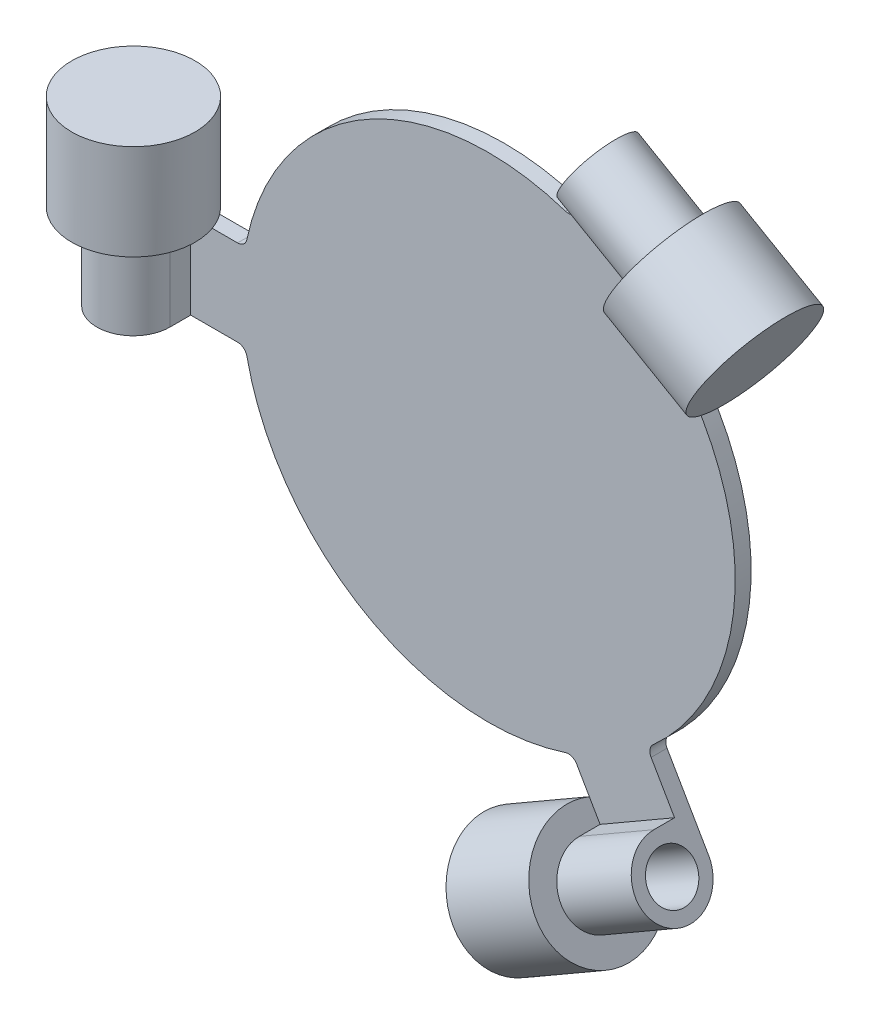
ISO-10303-21;
HEADER;
FILE_DESCRIPTION(('STEP AP214'),'2;1');
FILE_NAME('part.step','',(''),(''),'','','');
FILE_SCHEMA(('AUTOMOTIVE_DESIGN { 1 0 10303 214 1 1 1 1 }'));
ENDSEC;
DATA;
#1=APPLICATION_CONTEXT('core data for automotive mechanical design processes');
#2=APPLICATION_PROTOCOL_DEFINITION('international standard','automotive_design',2000,#1);
#3=PRODUCT_CONTEXT('',#1,'mechanical');
#4=PRODUCT('Part','Part','',(#3));
#5=PRODUCT_RELATED_PRODUCT_CATEGORY('part','',(#4));
#6=PRODUCT_DEFINITION_FORMATION('','',#4);
#7=PRODUCT_DEFINITION_CONTEXT('part definition',#1,'design');
#8=PRODUCT_DEFINITION('design','',#6,#7);
#9=PRODUCT_DEFINITION_SHAPE('','',#8);
#10=(LENGTH_UNIT() NAMED_UNIT(*) SI_UNIT(.MILLI.,.METRE.));
#11=(NAMED_UNIT(*) PLANE_ANGLE_UNIT() SI_UNIT($,.RADIAN.));
#12=(NAMED_UNIT(*) SI_UNIT($,.STERADIAN.) SOLID_ANGLE_UNIT());
#13=UNCERTAINTY_MEASURE_WITH_UNIT(LENGTH_MEASURE(1.E-05),#10,'distance_accuracy_value','');
#14=(GEOMETRIC_REPRESENTATION_CONTEXT(3) GLOBAL_UNCERTAINTY_ASSIGNED_CONTEXT((#13)) GLOBAL_UNIT_ASSIGNED_CONTEXT((#10,
#11,#12)) REPRESENTATION_CONTEXT('',''));
#15=CARTESIAN_POINT('',(0.,0.,0.));
#16=DIRECTION('',(0.,0.,1.));
#17=DIRECTION('',(1.,0.,0.));
#18=AXIS2_PLACEMENT_3D('',#15,#16,#17);
#19=CARTESIAN_POINT('',(35.05865704891,87.72337525384,11.5));
#20=DIRECTION('',(-0.500000000000017,-0.866025403784429,0.));
#21=DIRECTION('',(0.866025403784429,-0.500000000000017,0.));
#22=AXIS2_PLACEMENT_3D('',#19,#20,#21);
#23=PLANE('',#22);
#24=DIRECTION('',(0.,0.,1.));
#25=VECTOR('',#24,1.);
#26=CARTESIAN_POINT('',(35.05865704891,87.72337525385,0.));
#27=LINE('',#26,#25);
#28=CARTESIAN_POINT('',(35.05865704891,87.72337525385,5.));
#29=VERTEX_POINT('',#28);
#30=CARTESIAN_POINT('',(35.05865704891,87.7233752538495,11.5));
#31=VERTEX_POINT('',#30);
#32=EDGE_CURVE('E306',#29,#31,#27,.T.);
#33=ORIENTED_EDGE('',*,*,#32,.F.);
#34=DIRECTION('',(-0.86602540378428,0.500000000000275,0.));
#35=VECTOR('',#34,1.);
#36=CARTESIAN_POINT('',(58.44134295109,74.22337525384,5.));
#37=LINE('',#36,#35);
#38=CARTESIAN_POINT('',(58.4413429510908,74.2233752538395,5.));
#39=VERTEX_POINT('',#38);
#40=EDGE_CURVE('E313',#39,#29,#37,.T.);
#41=ORIENTED_EDGE('',*,*,#40,.F.);
#42=DIRECTION('',(0.,0.,1.));
#43=VECTOR('',#42,1.);
#44=CARTESIAN_POINT('',(58.4413429510911,74.2233752538393,0.));
#45=LINE('',#44,#43);
#46=CARTESIAN_POINT('',(58.4413429510918,74.2233752538431,11.5));
#47=VERTEX_POINT('',#46);
#48=EDGE_CURVE('E311',#47,#39,#45,.F.);
#49=ORIENTED_EDGE('',*,*,#48,.F.);
#50=DIRECTION('',(0.866025403784429,-0.500000000000017,0.));
#51=VECTOR('',#50,1.);
#52=CARTESIAN_POINT('',(35.0586570489098,87.7233752538491,11.5));
#53=LINE('',#52,#51);
#54=EDGE_CURVE('E212',#31,#47,#53,.T.);
#55=ORIENTED_EDGE('',*,*,#54,.F.);
#56=EDGE_LOOP('',(#33,#41,#49,#55));
#57=FACE_BOUND('',#56,.T.);
#58=ADVANCED_FACE('F35',(#57),#23,.T.);
#59=CARTESIAN_POINT('',(40.80865704891,97.68266739737,11.5));
#60=DIRECTION('',(0.866025403784429,-0.500000000000017,0.));
#61=DIRECTION('',(0.500000000000017,0.866025403784429,0.));
#62=AXIS2_PLACEMENT_3D('',#59,#60,#61);
#63=CYLINDRICAL_SURFACE('',#62,7.5);
#64=CARTESIAN_POINT('',(64.191342951091,84.1826673973687,11.5));
#65=DIRECTION('',(0.866025403784429,-0.500000000000017,0.));
#66=DIRECTION('',(0.500000000000017,0.866025403784429,0.));
#67=AXIS2_PLACEMENT_3D('',#64,#65,#66);
#68=CIRCLE('',#67,7.5);
#69=CARTESIAN_POINT('',(67.9413429510911,90.677857925752,11.5));
#70=VERTEX_POINT('',#69);
#71=EDGE_CURVE('E317',#70,#70,#68,.F.);
#72=ORIENTED_EDGE('',*,*,#71,.F.);
#73=EDGE_LOOP('',(#72));
#74=FACE_BOUND('',#73,.T.);
#75=CARTESIAN_POINT('',(40.808657048913,97.6826673973682,11.5));
#76=DIRECTION('',(0.866025403784429,-0.500000000000017,0.));
#77=DIRECTION('',(0.500000000000017,0.866025403784429,0.));
#78=AXIS2_PLACEMENT_3D('',#75,#76,#77);
#79=CIRCLE('',#78,7.5);
#80=CARTESIAN_POINT('',(44.5586570489132,104.177857925751,11.5));
#81=VERTEX_POINT('',#80);
#82=EDGE_CURVE('E305',#81,#81,#79,.T.);
#83=ORIENTED_EDGE('',*,*,#82,.F.);
#84=EDGE_LOOP('',(#83));
#85=FACE_BOUND('',#84,.T.);
#86=ADVANCED_FACE('F705',(#74,#85),#63,.F.);
#87=CARTESIAN_POINT('',(-93.5,-13.5,11.5));
#88=DIRECTION('',(1.,0.,0.));
#89=DIRECTION('',(0.,0.,-1.));
#90=AXIS2_PLACEMENT_3D('',#87,#88,#89);
#91=PLANE('',#90);
#92=DIRECTION('',(0.,0.,-1.));
#93=VECTOR('',#92,1.);
#94=CARTESIAN_POINT('',(-93.5,-13.5,0.));
#95=LINE('',#94,#93);
#96=CARTESIAN_POINT('',(-93.5,-13.5,5.));
#97=VERTEX_POINT('',#96);
#98=CARTESIAN_POINT('',(-93.5,-13.5,11.5));
#99=VERTEX_POINT('',#98);
#100=EDGE_CURVE('E275',#97,#99,#95,.F.);
#101=ORIENTED_EDGE('',*,*,#100,.F.);
#102=DIRECTION('',(0.,1.,0.));
#103=VECTOR('',#102,1.);
#104=CARTESIAN_POINT('',(-93.5,0.,5.));
#105=LINE('',#104,#103);
#106=CARTESIAN_POINT('',(-93.5,13.5,5.));
#107=VERTEX_POINT('',#106);
#108=EDGE_CURVE('E331',#107,#97,#105,.F.);
#109=ORIENTED_EDGE('',*,*,#108,.F.);
#110=DIRECTION('',(0.,0.,1.));
#111=VECTOR('',#110,1.);
#112=CARTESIAN_POINT('',(-93.5,13.5,0.));
#113=LINE('',#112,#111);
#114=CARTESIAN_POINT('',(-93.5,13.5,11.5));
#115=VERTEX_POINT('',#114);
#116=EDGE_CURVE('E286',#115,#107,#113,.F.);
#117=ORIENTED_EDGE('',*,*,#116,.F.);
#118=DIRECTION('',(0.,1.,0.));
#119=VECTOR('',#118,1.);
#120=CARTESIAN_POINT('',(-93.5,-13.5,11.5));
#121=LINE('',#120,#119);
#122=EDGE_CURVE('E404',#99,#115,#121,.T.);
#123=ORIENTED_EDGE('',*,*,#122,.F.);
#124=EDGE_LOOP('',(#101,#109,#117,#123));
#125=FACE_BOUND('',#124,.T.);
#126=ADVANCED_FACE('F467',(#125),#91,.T.);
#127=CARTESIAN_POINT('',(-105.,-13.5,11.5));
#128=DIRECTION('',(0.,1.,0.));
#129=DIRECTION('',(0.,0.,1.));
#130=AXIS2_PLACEMENT_3D('',#127,#128,#129);
#131=CYLINDRICAL_SURFACE('',#130,7.5);
#132=CARTESIAN_POINT('',(-105.,13.5,11.5));
#133=DIRECTION('',(0.,1.,0.));
#134=DIRECTION('',(0.,0.,1.));
#135=AXIS2_PLACEMENT_3D('',#132,#133,#134);
#136=CIRCLE('',#135,7.5);
#137=CARTESIAN_POINT('',(-105.,13.5,19.));
#138=VERTEX_POINT('',#137);
#139=EDGE_CURVE('E405',#138,#138,#136,.F.);
#140=ORIENTED_EDGE('',*,*,#139,.F.);
#141=EDGE_LOOP('',(#140));
#142=FACE_BOUND('',#141,.T.);
#143=CARTESIAN_POINT('',(-105.,-13.5,11.5));
#144=DIRECTION('',(0.,1.,0.));
#145=DIRECTION('',(0.,0.,1.));
#146=AXIS2_PLACEMENT_3D('',#143,#144,#145);
#147=CIRCLE('',#146,7.5);
#148=CARTESIAN_POINT('',(-105.,-13.5,19.));
#149=VERTEX_POINT('',#148);
#150=EDGE_CURVE('E274',#149,#149,#147,.T.);
#151=ORIENTED_EDGE('',*,*,#150,.F.);
#152=EDGE_LOOP('',(#151));
#153=FACE_BOUND('',#152,.T.);
#154=ADVANCED_FACE('F623',(#142,#153),#131,.F.);
#155=CARTESIAN_POINT('',(58.44134295109,-74.22337525385,11.5));
#156=DIRECTION('',(-0.500000000000017,0.866025403784429,0.));
#157=DIRECTION('',(-0.866025403784429,-0.500000000000017,0.));
#158=AXIS2_PLACEMENT_3D('',#155,#156,#157);
#159=PLANE('',#158);
#160=DIRECTION('',(0.,0.,1.));
#161=VECTOR('',#160,1.);
#162=CARTESIAN_POINT('',(58.44134295109,-74.22337525385,0.));
#163=LINE('',#162,#161);
#164=CARTESIAN_POINT('',(58.44134295109,-74.22337525385,5.));
#165=VERTEX_POINT('',#164);
#166=CARTESIAN_POINT('',(58.44134295109,-74.2233752538495,11.5));
#167=VERTEX_POINT('',#166);
#168=EDGE_CURVE('E244',#165,#167,#163,.T.);
#169=ORIENTED_EDGE('',*,*,#168,.F.);
#170=DIRECTION('',(0.86602540378444,0.499999999999998,0.));
#171=VECTOR('',#170,1.);
#172=CARTESIAN_POINT('',(35.05865704891,-87.72337525385,5.));
#173=LINE('',#172,#171);
#174=CARTESIAN_POINT('',(35.0586570489136,-87.7233752538479,5.));
#175=VERTEX_POINT('',#174);
#176=EDGE_CURVE('E329',#175,#165,#173,.T.);
#177=ORIENTED_EDGE('',*,*,#176,.F.);
#178=DIRECTION('',(0.,0.,1.));
#179=VECTOR('',#178,1.);
#180=CARTESIAN_POINT('',(35.0586570489155,-87.7233752538468,0.));
#181=LINE('',#180,#179);
#182=CARTESIAN_POINT('',(35.0586570489126,-87.7233752538482,11.5));
#183=VERTEX_POINT('',#182);
#184=EDGE_CURVE('E255',#183,#175,#181,.F.);
#185=ORIENTED_EDGE('',*,*,#184,.F.);
#186=DIRECTION('',(-0.866025403784429,-0.500000000000017,0.));
#187=VECTOR('',#186,1.);
#188=CARTESIAN_POINT('',(58.4413429510898,-74.2233752538491,11.5));
#189=LINE('',#188,#187);
#190=EDGE_CURVE('E326',#167,#183,#189,.T.);
#191=ORIENTED_EDGE('',*,*,#190,.F.);
#192=EDGE_LOOP('',(#169,#177,#185,#191));
#193=FACE_BOUND('',#192,.T.);
#194=ADVANCED_FACE('F628',(#193),#159,.T.);
#195=CARTESIAN_POINT('',(64.19134295109,-84.18266739737,11.5));
#196=DIRECTION('',(-0.866025403784429,-0.500000000000017,0.));
#197=DIRECTION('',(0.500000000000017,-0.866025403784429,0.));
#198=AXIS2_PLACEMENT_3D('',#195,#196,#197);
#199=CYLINDRICAL_SURFACE('',#198,7.5);
#200=CARTESIAN_POINT('',(40.8086570489332,-97.6826673973573,11.5));
#201=DIRECTION('',(-0.866025403784429,-0.500000000000017,0.));
#202=DIRECTION('',(0.500000000000017,-0.866025403784429,0.));
#203=AXIS2_PLACEMENT_3D('',#200,#201,#202);
#204=CIRCLE('',#203,7.5);
#205=CARTESIAN_POINT('',(44.5586570489334,-104.17785792574,11.5));
#206=VERTEX_POINT('',#205);
#207=EDGE_CURVE('E328',#206,#206,#204,.F.);
#208=ORIENTED_EDGE('',*,*,#207,.F.);
#209=EDGE_LOOP('',(#208));
#210=FACE_BOUND('',#209,.T.);
#211=CARTESIAN_POINT('',(64.191342951093,-84.1826673973682,11.5));
#212=DIRECTION('',(-0.866025403784429,-0.500000000000017,0.));
#213=DIRECTION('',(0.500000000000017,-0.866025403784429,0.));
#214=AXIS2_PLACEMENT_3D('',#211,#212,#213);
#215=CIRCLE('',#214,7.5);
#216=CARTESIAN_POINT('',(67.9413429510931,-90.6778579257515,11.5));
#217=VERTEX_POINT('',#216);
#218=EDGE_CURVE('E243',#217,#217,#215,.T.);
#219=ORIENTED_EDGE('',*,*,#218,.F.);
#220=EDGE_LOOP('',(#219));
#221=FACE_BOUND('',#220,.T.);
#222=ADVANCED_FACE('F636',(#210,#221),#199,.F.);
#223=CARTESIAN_POINT('',(0.,0.,5.));
#224=DIRECTION('',(0.,0.,1.));
#225=DIRECTION('',(1.,0.,0.));
#226=AXIS2_PLACEMENT_3D('',#223,#224,#225);
#227=PLANE('',#226);
#228=DIRECTION('',(0.500000000000017,0.866025403784429,0.));
#229=VECTOR('',#228,1.);
#230=CARTESIAN_POINT('',(49.84891100777,59.34084656743,5.));
#231=LINE('',#230,#229);
#232=CARTESIAN_POINT('',(55.0665253972339,68.3780197842836,5.));
#233=VERTEX_POINT('',#232);
#234=EDGE_CURVE('E316',#39,#233,#231,.F.);
#235=ORIENTED_EDGE('',*,*,#234,.F.);
#236=ORIENTED_EDGE('',*,*,#40,.T.);
#237=DIRECTION('',(-0.500000000000017,-0.866025403784429,0.));
#238=VECTOR('',#237,1.);
#239=CARTESIAN_POINT('',(35.05865704891,87.72337525385,5.));
#240=LINE('',#239,#238);
#241=CARTESIAN_POINT('',(27.7040882560926,74.9848884369295,5.));
#242=VERTEX_POINT('',#241);
#243=EDGE_CURVE('E216',#242,#29,#240,.F.);
#244=ORIENTED_EDGE('',*,*,#243,.F.);
#245=CARTESIAN_POINT('',(25.10601204474,76.48488843693,5.));
#246=DIRECTION('',(0.,0.,1.));
#247=DIRECTION('',(1.,0.,0.));
#248=AXIS2_PLACEMENT_3D('',#245,#246,#247);
#249=CIRCLE('',#248,3.);
#250=CARTESIAN_POINT('',(24.1703842666772,73.6345199237502,5.));
#251=VERTEX_POINT('',#250);
#252=EDGE_CURVE('E304',#242,#251,#249,.F.);
#253=ORIENTED_EDGE('',*,*,#252,.T.);
#254=CARTESIAN_POINT('',(0.,0.,5.));
#255=DIRECTION('',(0.,0.,1.));
#256=DIRECTION('',(1.,0.,0.));
#257=AXIS2_PLACEMENT_3D('',#254,#255,#256);
#258=CIRCLE('',#257,77.5);
#259=CARTESIAN_POINT('',(-75.8545569827783,15.8850931677007,5.));
#260=VERTEX_POINT('',#259);
#261=EDGE_CURVE('E300',#260,#251,#258,.F.);
#262=ORIENTED_EDGE('',*,*,#261,.F.);
#263=CARTESIAN_POINT('',(-78.79086241437,16.5,5.));
#264=DIRECTION('',(0.,0.,1.));
#265=DIRECTION('',(1.,0.,0.));
#266=AXIS2_PLACEMENT_3D('',#263,#264,#265);
#267=CIRCLE('',#266,3.);
#268=CARTESIAN_POINT('',(-78.79086241437,13.5,5.));
#269=VERTEX_POINT('',#268);
#270=EDGE_CURVE('E294',#260,#269,#267,.F.);
#271=ORIENTED_EDGE('',*,*,#270,.T.);
#272=DIRECTION('',(1.,0.,0.));
#273=VECTOR('',#272,1.);
#274=CARTESIAN_POINT('',(-76.31513611336,13.5,5.));
#275=LINE('',#274,#273);
#276=CARTESIAN_POINT('',(-86.7503648922814,13.5,5.));
#277=VERTEX_POINT('',#276);
#278=EDGE_CURVE('E289',#277,#269,#275,.T.);
#279=ORIENTED_EDGE('',*,*,#278,.F.);
#280=EDGE_CURVE('E344',#107,#277,#275,.T.);
#281=ORIENTED_EDGE('',*,*,#280,.F.);
#282=ORIENTED_EDGE('',*,*,#108,.T.);
#283=DIRECTION('',(1.,0.,0.));
#284=VECTOR('',#283,1.);
#285=CARTESIAN_POINT('',(-93.5,-13.5,5.));
#286=LINE('',#285,#284);
#287=CARTESIAN_POINT('',(-78.79086241437,-13.5,5.));
#288=VERTEX_POINT('',#287);
#289=EDGE_CURVE('E278',#288,#97,#286,.F.);
#290=ORIENTED_EDGE('',*,*,#289,.F.);
#291=CARTESIAN_POINT('',(-78.79086241437,-16.5,5.));
#292=DIRECTION('',(0.,0.,1.));
#293=DIRECTION('',(1.,0.,0.));
#294=AXIS2_PLACEMENT_3D('',#291,#292,#293);
#295=CIRCLE('',#294,3.);
#296=CARTESIAN_POINT('',(-75.8545569827777,-15.8850931677006,5.));
#297=VERTEX_POINT('',#296);
#298=EDGE_CURVE('E273',#288,#297,#295,.F.);
#299=ORIENTED_EDGE('',*,*,#298,.T.);
#300=CARTESIAN_POINT('',(0.,0.,5.));
#301=DIRECTION('',(0.,0.,1.));
#302=DIRECTION('',(1.,0.,0.));
#303=AXIS2_PLACEMENT_3D('',#300,#301,#302);
#304=CIRCLE('',#303,77.5);
#305=CARTESIAN_POINT('',(24.1703842666775,-73.6345199237509,5.));
#306=VERTEX_POINT('',#305);
#307=EDGE_CURVE('E269',#306,#297,#304,.F.);
#308=ORIENTED_EDGE('',*,*,#307,.F.);
#309=CARTESIAN_POINT('',(25.10601204474,-76.48488843693,5.));
#310=DIRECTION('',(0.,0.,1.));
#311=DIRECTION('',(1.,0.,0.));
#312=AXIS2_PLACEMENT_3D('',#309,#310,#311);
#313=CIRCLE('',#312,3.);
#314=CARTESIAN_POINT('',(27.7040882560977,-74.9848884369265,5.));
#315=VERTEX_POINT('',#314);
#316=EDGE_CURVE('E263',#306,#315,#313,.F.);
#317=ORIENTED_EDGE('',*,*,#316,.T.);
#318=DIRECTION('',(0.500000000000017,-0.866025403784429,0.));
#319=VECTOR('',#318,1.);
#320=CARTESIAN_POINT('',(26.46622510559,-72.84084656743,5.));
#321=LINE('',#320,#319);
#322=CARTESIAN_POINT('',(31.683839495054,-81.8780197842836,5.));
#323=VERTEX_POINT('',#322);
#324=EDGE_CURVE('E258',#323,#315,#321,.F.);
#325=ORIENTED_EDGE('',*,*,#324,.F.);
#326=EDGE_CURVE('E334',#175,#323,#321,.F.);
#327=ORIENTED_EDGE('',*,*,#326,.F.);
#328=ORIENTED_EDGE('',*,*,#176,.T.);
#329=DIRECTION('',(-0.500000000000017,0.866025403784429,0.));
#330=VECTOR('',#329,1.);
#331=CARTESIAN_POINT('',(58.44134295109,-74.22337525385,5.));
#332=LINE('',#331,#330);
#333=CARTESIAN_POINT('',(51.0867741582743,-61.4848884369295,5.));
#334=VERTEX_POINT('',#333);
#335=EDGE_CURVE('E247',#334,#165,#332,.F.);
#336=ORIENTED_EDGE('',*,*,#335,.F.);
#337=CARTESIAN_POINT('',(53.68485036963,-59.98488843693,5.));
#338=DIRECTION('',(0.,0.,1.));
#339=DIRECTION('',(1.,0.,0.));
#340=AXIS2_PLACEMENT_3D('',#337,#338,#339);
#341=CIRCLE('',#340,3.);
#342=CARTESIAN_POINT('',(51.6841727161006,-57.7494267560491,5.));
#343=VERTEX_POINT('',#342);
#344=EDGE_CURVE('E242',#334,#343,#341,.F.);
#345=ORIENTED_EDGE('',*,*,#344,.T.);
#346=CARTESIAN_POINT('',(0.,0.,5.));
#347=DIRECTION('',(0.,0.,1.));
#348=DIRECTION('',(1.,0.,0.));
#349=AXIS2_PLACEMENT_3D('',#346,#347,#348);
#350=CIRCLE('',#349,77.5);
#351=CARTESIAN_POINT('',(51.6841727161017,57.7494267560503,5.));
#352=VERTEX_POINT('',#351);
#353=EDGE_CURVE('E238',#352,#343,#350,.F.);
#354=ORIENTED_EDGE('',*,*,#353,.F.);
#355=CARTESIAN_POINT('',(53.68485036963,59.98488843693,5.));
#356=DIRECTION('',(0.,0.,1.));
#357=DIRECTION('',(1.,0.,0.));
#358=AXIS2_PLACEMENT_3D('',#355,#356,#357);
#359=CIRCLE('',#358,3.);
#360=CARTESIAN_POINT('',(51.086774158277,61.4848884369279,5.));
#361=VERTEX_POINT('',#360);
#362=EDGE_CURVE('E223',#352,#361,#359,.F.);
#363=ORIENTED_EDGE('',*,*,#362,.T.);
#364=EDGE_CURVE('E38',#233,#361,#231,.F.);
#365=ORIENTED_EDGE('',*,*,#364,.F.);
#366=EDGE_LOOP('',(#235,#236,#244,#253,#262,#271,#279,#281,#282,#290,#299,#308,#317,#325,#327,
#328,#336,#345,#354,#363,#365));
#367=FACE_BOUND('',#366,.T.);
#368=ADVANCED_FACE('F473',(#367),#227,.T.);
#369=CARTESIAN_POINT('',(49.84891100777,59.34084656743,0.));
#370=DIRECTION('',(0.866025403784429,-0.500000000000017,0.));
#371=DIRECTION('',(0.500000000000017,0.866025403784429,0.));
#372=AXIS2_PLACEMENT_3D('',#369,#370,#371);
#373=PLANE('',#372);
#374=DIRECTION('',(0.500000000000095,0.866025403784384,0.));
#375=VECTOR('',#374,1.);
#376=CARTESIAN_POINT('',(51.08677415827,61.48488843693,0.));
#377=LINE('',#376,#375);
#378=CARTESIAN_POINT('',(51.0867741582734,61.4848884369301,0.));
#379=VERTEX_POINT('',#378);
#380=CARTESIAN_POINT('',(56.3963256072178,70.6813013119062,0.));
#381=VERTEX_POINT('',#380);
#382=EDGE_CURVE('E206',#379,#381,#377,.T.);
#383=ORIENTED_EDGE('',*,*,#382,.T.);
#384=CARTESIAN_POINT('',(64.1913429510891,84.1826673973666,11.5));
#385=DIRECTION('',(0.866025403784443,-0.499999999999992,0.));
#386=DIRECTION('',(0.,0.,1.));
#387=AXIS2_PLACEMENT_3D('',#384,#385,#386);
#388=CIRCLE('',#387,19.3726400256877);
#389=EDGE_CURVE('E52',#233,#381,#388,.T.);
#390=ORIENTED_EDGE('',*,*,#389,.F.);
#391=ORIENTED_EDGE('',*,*,#364,.T.);
#392=DIRECTION('',(0.,0.,1.));
#393=VECTOR('',#392,1.);
#394=CARTESIAN_POINT('',(51.086774158275,61.4848884369271,-6.518));
#395=LINE('',#394,#393);
#396=EDGE_CURVE('E231',#361,#379,#395,.F.);
#397=ORIENTED_EDGE('',*,*,#396,.T.);
#398=EDGE_LOOP('',(#383,#390,#391,#397));
#399=FACE_BOUND('',#398,.T.);
#400=ADVANCED_FACE('F662',(#399),#373,.T.);
#401=CARTESIAN_POINT('',(40.80865704891,97.68266739737,11.5));
#402=DIRECTION('',(0.866025403784429,-0.500000000000017,0.));
#403=DIRECTION('',(0.500000000000017,0.866025403784429,0.));
#404=AXIS2_PLACEMENT_3D('',#401,#402,#403);
#405=CYLINDRICAL_SURFACE('',#404,11.5);
#406=DIRECTION('',(-0.86602540378444,0.499999999999997,0.));
#407=VECTOR('',#406,1.);
#408=CARTESIAN_POINT('',(64.19134295109,84.18266739737,0.));
#409=LINE('',#408,#407);
#410=CARTESIAN_POINT('',(64.1913429510908,84.1826673973695,0.));
#411=VERTEX_POINT('',#410);
#412=CARTESIAN_POINT('',(40.80865704891,97.68266739737,0.));
#413=VERTEX_POINT('',#412);
#414=EDGE_CURVE('E197',#411,#413,#409,.T.);
#415=ORIENTED_EDGE('',*,*,#414,.T.);
#416=CARTESIAN_POINT('',(40.80865704891,97.68266739737,11.5));
#417=DIRECTION('',(0.866025403784429,-0.500000000000017,0.));
#418=DIRECTION('',(0.500000000000017,0.866025403784429,0.));
#419=AXIS2_PLACEMENT_3D('',#416,#417,#418);
#420=CIRCLE('',#419,11.5);
#421=EDGE_CURVE('E308',#31,#413,#420,.F.);
#422=ORIENTED_EDGE('',*,*,#421,.F.);
#423=ORIENTED_EDGE('',*,*,#54,.T.);
#424=CARTESIAN_POINT('',(64.1913429510938,84.1826673973671,11.5));
#425=DIRECTION('',(0.866025403784429,-0.500000000000017,0.));
#426=DIRECTION('',(0.500000000000017,0.866025403784429,0.));
#427=AXIS2_PLACEMENT_3D('',#424,#425,#426);
#428=CIRCLE('',#427,11.5);
#429=EDGE_CURVE('E209',#47,#411,#428,.F.);
#430=ORIENTED_EDGE('',*,*,#429,.T.);
#431=EDGE_LOOP('',(#415,#422,#423,#430));
#432=FACE_BOUND('',#431,.T.);
#433=ADVANCED_FACE('F210',(#432),#405,.T.);
#434=CARTESIAN_POINT('',(35.05865704891,87.72337525385,0.));
#435=DIRECTION('',(-0.866025403784429,0.500000000000017,0.));
#436=DIRECTION('',(-0.500000000000017,-0.866025403784429,0.));
#437=AXIS2_PLACEMENT_3D('',#434,#435,#436);
#438=PLANE('',#437);
#439=ORIENTED_EDGE('',*,*,#82,.T.);
#440=EDGE_LOOP('',(#439));
#441=FACE_BOUND('',#440,.T.);
#442=ORIENTED_EDGE('',*,*,#421,.T.);
#443=DIRECTION('',(-0.500000000000096,-0.866025403784383,0.));
#444=VECTOR('',#443,1.);
#445=CARTESIAN_POINT('',(40.80865704891,97.68266739737,0.));
#446=LINE('',#445,#444);
#447=CARTESIAN_POINT('',(27.7040882560916,74.9848884369299,0.));
#448=VERTEX_POINT('',#447);
#449=EDGE_CURVE('E203',#413,#448,#446,.T.);
#450=ORIENTED_EDGE('',*,*,#449,.T.);
#451=DIRECTION('',(0.,0.,1.));
#452=VECTOR('',#451,1.);
#453=CARTESIAN_POINT('',(27.7040882560925,74.9848884369286,-6.518));
#454=LINE('',#453,#452);
#455=EDGE_CURVE('E301',#448,#242,#454,.T.);
#456=ORIENTED_EDGE('',*,*,#455,.T.);
#457=ORIENTED_EDGE('',*,*,#243,.T.);
#458=ORIENTED_EDGE('',*,*,#32,.T.);
#459=EDGE_LOOP('',(#442,#450,#456,#457,#458));
#460=FACE_BOUND('',#459,.T.);
#461=ADVANCED_FACE('F416',(#441,#460),#438,.T.);
#462=CARTESIAN_POINT('',(25.10601204474,76.48488843693,-6.518));
#463=DIRECTION('',(0.,0.,1.));
#464=DIRECTION('',(1.,0.,0.));
#465=AXIS2_PLACEMENT_3D('',#462,#463,#464);
#466=CYLINDRICAL_SURFACE('',#465,3.);
#467=ORIENTED_EDGE('',*,*,#455,.F.);
#468=CARTESIAN_POINT('',(25.10601204474,76.48488843693,0.));
#469=DIRECTION('',(0.,0.,1.));
#470=DIRECTION('',(1.,0.,0.));
#471=AXIS2_PLACEMENT_3D('',#468,#469,#470);
#472=CIRCLE('',#471,3.);
#473=CARTESIAN_POINT('',(24.1703842666772,73.6345199237502,0.));
#474=VERTEX_POINT('',#473);
#475=EDGE_CURVE('E380',#448,#474,#472,.F.);
#476=ORIENTED_EDGE('',*,*,#475,.T.);
#477=DIRECTION('',(0.,0.,1.));
#478=VECTOR('',#477,1.);
#479=CARTESIAN_POINT('',(24.1703842666798,73.6345199237493,0.));
#480=LINE('',#479,#478);
#481=EDGE_CURVE('E298',#251,#474,#480,.F.);
#482=ORIENTED_EDGE('',*,*,#481,.F.);
#483=ORIENTED_EDGE('',*,*,#252,.F.);
#484=EDGE_LOOP('',(#467,#476,#482,#483));
#485=FACE_BOUND('',#484,.T.);
#486=ADVANCED_FACE('F484',(#485),#466,.F.);
#487=CARTESIAN_POINT('',(0.,0.,0.));
#488=DIRECTION('',(0.,0.,1.));
#489=DIRECTION('',(1.,0.,0.));
#490=AXIS2_PLACEMENT_3D('',#487,#488,#489);
#491=CYLINDRICAL_SURFACE('',#490,77.5);
#492=CARTESIAN_POINT('',(0.,0.,0.));
#493=DIRECTION('',(0.,0.,1.));
#494=DIRECTION('',(1.,0.,0.));
#495=AXIS2_PLACEMENT_3D('',#492,#493,#494);
#496=CIRCLE('',#495,77.5);
#497=CARTESIAN_POINT('',(-75.8545569827788,15.8850931677008,0.));
#498=VERTEX_POINT('',#497);
#499=EDGE_CURVE('E377',#474,#498,#496,.T.);
#500=ORIENTED_EDGE('',*,*,#499,.T.);
#501=DIRECTION('',(0.,0.,1.));
#502=VECTOR('',#501,1.);
#503=CARTESIAN_POINT('',(-75.854556982779,15.8850931676998,-6.518));
#504=LINE('',#503,#502);
#505=EDGE_CURVE('E295',#498,#260,#504,.T.);
#506=ORIENTED_EDGE('',*,*,#505,.T.);
#507=ORIENTED_EDGE('',*,*,#261,.T.);
#508=ORIENTED_EDGE('',*,*,#481,.T.);
#509=EDGE_LOOP('',(#500,#506,#507,#508));
#510=FACE_BOUND('',#509,.T.);
#511=ADVANCED_FACE('F480',(#510),#491,.T.);
#512=CARTESIAN_POINT('',(-78.79086241437,16.5,-6.518));
#513=DIRECTION('',(0.,0.,1.));
#514=DIRECTION('',(1.,0.,0.));
#515=AXIS2_PLACEMENT_3D('',#512,#513,#514);
#516=CYLINDRICAL_SURFACE('',#515,3.);
#517=ORIENTED_EDGE('',*,*,#505,.F.);
#518=CARTESIAN_POINT('',(-78.79086241437,16.5,0.));
#519=DIRECTION('',(0.,0.,1.));
#520=DIRECTION('',(1.,0.,0.));
#521=AXIS2_PLACEMENT_3D('',#518,#519,#520);
#522=CIRCLE('',#521,3.);
#523=CARTESIAN_POINT('',(-78.79086241437,13.5,0.));
#524=VERTEX_POINT('',#523);
#525=EDGE_CURVE('E373',#498,#524,#522,.F.);
#526=ORIENTED_EDGE('',*,*,#525,.T.);
#527=DIRECTION('',(0.,0.,1.));
#528=VECTOR('',#527,1.);
#529=CARTESIAN_POINT('',(-78.79086241437,13.5,0.));
#530=LINE('',#529,#528);
#531=EDGE_CURVE('E290',#269,#524,#530,.F.);
#532=ORIENTED_EDGE('',*,*,#531,.F.);
#533=ORIENTED_EDGE('',*,*,#270,.F.);
#534=EDGE_LOOP('',(#517,#526,#532,#533));
#535=FACE_BOUND('',#534,.T.);
#536=ADVANCED_FACE('F477',(#535),#516,.F.);
#537=CARTESIAN_POINT('',(-76.31513611336,13.5,0.));
#538=DIRECTION('',(0.,1.,0.));
#539=DIRECTION('',(0.,0.,1.));
#540=AXIS2_PLACEMENT_3D('',#537,#538,#539);
#541=PLANE('',#540);
#542=DIRECTION('',(1.,0.,0.));
#543=VECTOR('',#542,1.);
#544=CARTESIAN_POINT('',(0.,13.5,0.));
#545=LINE('',#544,#543);
#546=CARTESIAN_POINT('',(-89.4099653122619,13.5,0.));
#547=VERTEX_POINT('',#546);
#548=EDGE_CURVE('E285',#524,#547,#545,.F.);
#549=ORIENTED_EDGE('',*,*,#548,.T.);
#550=CARTESIAN_POINT('',(-105.,13.5,11.5));
#551=DIRECTION('',(0.,1.,0.));
#552=DIRECTION('',(0.,0.,1.));
#553=AXIS2_PLACEMENT_3D('',#550,#551,#552);
#554=CIRCLE('',#553,19.3726400256877);
#555=EDGE_CURVE('E438',#277,#547,#554,.T.);
#556=ORIENTED_EDGE('',*,*,#555,.F.);
#557=ORIENTED_EDGE('',*,*,#278,.T.);
#558=ORIENTED_EDGE('',*,*,#531,.T.);
#559=EDGE_LOOP('',(#549,#556,#557,#558));
#560=FACE_BOUND('',#559,.T.);
#561=ADVANCED_FACE('F472',(#560),#541,.T.);
#562=CARTESIAN_POINT('',(-105.,-13.5,11.5));
#563=DIRECTION('',(0.,1.,0.));
#564=DIRECTION('',(0.,0.,1.));
#565=AXIS2_PLACEMENT_3D('',#562,#563,#564);
#566=CYLINDRICAL_SURFACE('',#565,11.5);
#567=DIRECTION('',(0.,1.,0.));
#568=VECTOR('',#567,1.);
#569=CARTESIAN_POINT('',(-105.,0.,0.));
#570=LINE('',#569,#568);
#571=CARTESIAN_POINT('',(-105.,13.5,0.));
#572=VERTEX_POINT('',#571);
#573=CARTESIAN_POINT('',(-105.,-13.5,0.));
#574=VERTEX_POINT('',#573);
#575=EDGE_CURVE('E281',#572,#574,#570,.F.);
#576=ORIENTED_EDGE('',*,*,#575,.T.);
#577=CARTESIAN_POINT('',(-105.,-13.5,11.5));
#578=DIRECTION('',(0.,1.,0.));
#579=DIRECTION('',(0.,0.,1.));
#580=AXIS2_PLACEMENT_3D('',#577,#578,#579);
#581=CIRCLE('',#580,11.5);
#582=EDGE_CURVE('E277',#99,#574,#581,.F.);
#583=ORIENTED_EDGE('',*,*,#582,.F.);
#584=ORIENTED_EDGE('',*,*,#122,.T.);
#585=CARTESIAN_POINT('',(-105.,13.5,11.5));
#586=DIRECTION('',(0.,1.,0.));
#587=DIRECTION('',(0.,0.,1.));
#588=AXIS2_PLACEMENT_3D('',#585,#586,#587);
#589=CIRCLE('',#588,11.5);
#590=EDGE_CURVE('E401',#115,#572,#589,.F.);
#591=ORIENTED_EDGE('',*,*,#590,.T.);
#592=EDGE_LOOP('',(#576,#583,#584,#591));
#593=FACE_BOUND('',#592,.T.);
#594=ADVANCED_FACE('F461',(#593),#566,.T.);
#595=CARTESIAN_POINT('',(-93.5,-13.5,0.));
#596=DIRECTION('',(0.,-1.,0.));
#597=DIRECTION('',(0.,0.,-1.));
#598=AXIS2_PLACEMENT_3D('',#595,#596,#597);
#599=PLANE('',#598);
#600=ORIENTED_EDGE('',*,*,#150,.T.);
#601=EDGE_LOOP('',(#600));
#602=FACE_BOUND('',#601,.T.);
#603=ORIENTED_EDGE('',*,*,#582,.T.);
#604=DIRECTION('',(1.,0.,0.));
#605=VECTOR('',#604,1.);
#606=CARTESIAN_POINT('',(0.,-13.5,0.));
#607=LINE('',#606,#605);
#608=CARTESIAN_POINT('',(-78.79086241437,-13.5,0.));
#609=VERTEX_POINT('',#608);
#610=EDGE_CURVE('E284',#574,#609,#607,.T.);
#611=ORIENTED_EDGE('',*,*,#610,.T.);
#612=DIRECTION('',(0.,0.,1.));
#613=VECTOR('',#612,1.);
#614=CARTESIAN_POINT('',(-78.79086241437,-13.5,-6.518));
#615=LINE('',#614,#613);
#616=EDGE_CURVE('E270',#609,#288,#615,.T.);
#617=ORIENTED_EDGE('',*,*,#616,.T.);
#618=ORIENTED_EDGE('',*,*,#289,.T.);
#619=ORIENTED_EDGE('',*,*,#100,.T.);
#620=EDGE_LOOP('',(#603,#611,#617,#618,#619));
#621=FACE_BOUND('',#620,.T.);
#622=ADVANCED_FACE('F539',(#602,#621),#599,.T.);
#623=CARTESIAN_POINT('',(-78.79086241437,-16.5,-6.518));
#624=DIRECTION('',(0.,0.,1.));
#625=DIRECTION('',(1.,0.,0.));
#626=AXIS2_PLACEMENT_3D('',#623,#624,#625);
#627=CYLINDRICAL_SURFACE('',#626,3.);
#628=ORIENTED_EDGE('',*,*,#616,.F.);
#629=CARTESIAN_POINT('',(-78.79086241437,-16.5,0.));
#630=DIRECTION('',(0.,0.,1.));
#631=DIRECTION('',(1.,0.,0.));
#632=AXIS2_PLACEMENT_3D('',#629,#630,#631);
#633=CIRCLE('',#632,3.);
#634=CARTESIAN_POINT('',(-75.8545569827777,-15.8850931677006,0.));
#635=VERTEX_POINT('',#634);
#636=EDGE_CURVE('E370',#609,#635,#633,.F.);
#637=ORIENTED_EDGE('',*,*,#636,.T.);
#638=DIRECTION('',(0.,0.,1.));
#639=VECTOR('',#638,1.);
#640=CARTESIAN_POINT('',(-75.8545569827779,-15.8850931676995,0.));
#641=LINE('',#640,#639);
#642=EDGE_CURVE('E267',#297,#635,#641,.F.);
#643=ORIENTED_EDGE('',*,*,#642,.F.);
#644=ORIENTED_EDGE('',*,*,#298,.F.);
#645=EDGE_LOOP('',(#628,#637,#643,#644));
#646=FACE_BOUND('',#645,.T.);
#647=ADVANCED_FACE('F535',(#646),#627,.F.);
#648=CARTESIAN_POINT('',(0.,0.,0.));
#649=DIRECTION('',(0.,0.,1.));
#650=DIRECTION('',(1.,0.,0.));
#651=AXIS2_PLACEMENT_3D('',#648,#649,#650);
#652=CYLINDRICAL_SURFACE('',#651,77.5);
#653=ORIENTED_EDGE('',*,*,#307,.T.);
#654=ORIENTED_EDGE('',*,*,#642,.T.);
#655=CARTESIAN_POINT('',(0.,0.,0.));
#656=DIRECTION('',(0.,0.,1.));
#657=DIRECTION('',(1.,0.,0.));
#658=AXIS2_PLACEMENT_3D('',#655,#656,#657);
#659=CIRCLE('',#658,77.5);
#660=CARTESIAN_POINT('',(24.1703842666777,-73.6345199237517,0.));
#661=VERTEX_POINT('',#660);
#662=EDGE_CURVE('E367',#635,#661,#659,.T.);
#663=ORIENTED_EDGE('',*,*,#662,.T.);
#664=DIRECTION('',(0.,0.,1.));
#665=VECTOR('',#664,1.);
#666=CARTESIAN_POINT('',(24.1703842666803,-73.6345199237509,-6.518));
#667=LINE('',#666,#665);
#668=EDGE_CURVE('E264',#661,#306,#667,.T.);
#669=ORIENTED_EDGE('',*,*,#668,.T.);
#670=EDGE_LOOP('',(#653,#654,#663,#669));
#671=FACE_BOUND('',#670,.T.);
#672=ADVANCED_FACE('F531',(#671),#652,.T.);
#673=CARTESIAN_POINT('',(25.10601204474,-76.48488843693,-6.518));
#674=DIRECTION('',(0.,0.,1.));
#675=DIRECTION('',(1.,0.,0.));
#676=AXIS2_PLACEMENT_3D('',#673,#674,#675);
#677=CYLINDRICAL_SURFACE('',#676,3.);
#678=ORIENTED_EDGE('',*,*,#668,.F.);
#679=CARTESIAN_POINT('',(25.10601204474,-76.48488843693,0.));
#680=DIRECTION('',(0.,0.,1.));
#681=DIRECTION('',(1.,0.,0.));
#682=AXIS2_PLACEMENT_3D('',#679,#680,#681);
#683=CIRCLE('',#682,3.);
#684=CARTESIAN_POINT('',(27.704088256094,-74.9848884369285,0.));
#685=VERTEX_POINT('',#684);
#686=EDGE_CURVE('E363',#661,#685,#683,.F.);
#687=ORIENTED_EDGE('',*,*,#686,.T.);
#688=DIRECTION('',(0.,0.,1.));
#689=VECTOR('',#688,1.);
#690=CARTESIAN_POINT('',(27.7040882560973,-74.9848884369258,0.));
#691=LINE('',#690,#689);
#692=EDGE_CURVE('E259',#315,#685,#691,.F.);
#693=ORIENTED_EDGE('',*,*,#692,.F.);
#694=ORIENTED_EDGE('',*,*,#316,.F.);
#695=EDGE_LOOP('',(#678,#687,#693,#694));
#696=FACE_BOUND('',#695,.T.);
#697=ADVANCED_FACE('F527',(#696),#677,.F.);
#698=CARTESIAN_POINT('',(26.46622510559,-72.84084656743,0.));
#699=DIRECTION('',(-0.866025403784429,-0.500000000000017,0.));
#700=DIRECTION('',(0.500000000000017,-0.866025403784429,0.));
#701=AXIS2_PLACEMENT_3D('',#698,#699,#700);
#702=PLANE('',#701);
#703=DIRECTION('',(0.500000000000096,-0.866025403784383,0.));
#704=VECTOR('',#703,1.);
#705=CARTESIAN_POINT('',(27.70408825609,-74.98488843693,0.));
#706=LINE('',#705,#704);
#707=CARTESIAN_POINT('',(33.0136397050378,-84.1813013119063,0.));
#708=VERTEX_POINT('',#707);
#709=EDGE_CURVE('E254',#685,#708,#706,.T.);
#710=ORIENTED_EDGE('',*,*,#709,.T.);
#711=CARTESIAN_POINT('',(40.8086570489105,-97.6826673973659,11.5));
#712=DIRECTION('',(-0.866025403784436,-0.500000000000004,0.));
#713=DIRECTION('',(0.,0.,1.));
#714=AXIS2_PLACEMENT_3D('',#711,#712,#713);
#715=CIRCLE('',#714,19.3726400256877);
#716=EDGE_CURVE('E431',#323,#708,#715,.T.);
#717=ORIENTED_EDGE('',*,*,#716,.F.);
#718=ORIENTED_EDGE('',*,*,#324,.T.);
#719=ORIENTED_EDGE('',*,*,#692,.T.);
#720=EDGE_LOOP('',(#710,#717,#718,#719));
#721=FACE_BOUND('',#720,.T.);
#722=ADVANCED_FACE('F523',(#721),#702,.T.);
#723=CARTESIAN_POINT('',(64.19134295109,-84.18266739737,11.5));
#724=DIRECTION('',(-0.866025403784429,-0.500000000000017,0.));
#725=DIRECTION('',(0.500000000000017,-0.866025403784429,0.));
#726=AXIS2_PLACEMENT_3D('',#723,#724,#725);
#727=CYLINDRICAL_SURFACE('',#726,11.5);
#728=DIRECTION('',(0.86602540378444,0.499999999999997,0.));
#729=VECTOR('',#728,1.);
#730=CARTESIAN_POINT('',(40.80865704891,-97.68266739737,0.));
#731=LINE('',#730,#729);
#732=CARTESIAN_POINT('',(40.8086570489131,-97.6826673973703,0.));
#733=VERTEX_POINT('',#732);
#734=CARTESIAN_POINT('',(64.19134295109,-84.18266739737,0.));
#735=VERTEX_POINT('',#734);
#736=EDGE_CURVE('E250',#733,#735,#731,.T.);
#737=ORIENTED_EDGE('',*,*,#736,.T.);
#738=CARTESIAN_POINT('',(64.19134295109,-84.18266739737,11.5));
#739=DIRECTION('',(-0.866025403784429,-0.500000000000017,0.));
#740=DIRECTION('',(0.500000000000017,-0.866025403784429,0.));
#741=AXIS2_PLACEMENT_3D('',#738,#739,#740);
#742=CIRCLE('',#741,11.5);
#743=EDGE_CURVE('E246',#167,#735,#742,.F.);
#744=ORIENTED_EDGE('',*,*,#743,.F.);
#745=ORIENTED_EDGE('',*,*,#190,.T.);
#746=CARTESIAN_POINT('',(40.80865704891,-97.6826673973707,11.5));
#747=DIRECTION('',(-0.866025403784429,-0.500000000000017,0.));
#748=DIRECTION('',(0.500000000000017,-0.866025403784429,0.));
#749=AXIS2_PLACEMENT_3D('',#746,#747,#748);
#750=CIRCLE('',#749,11.5);
#751=EDGE_CURVE('E323',#183,#733,#750,.F.);
#752=ORIENTED_EDGE('',*,*,#751,.T.);
#753=EDGE_LOOP('',(#737,#744,#745,#752));
#754=FACE_BOUND('',#753,.T.);
#755=ADVANCED_FACE('F519',(#754),#727,.T.);
#756=CARTESIAN_POINT('',(58.44134295109,-74.22337525385,0.));
#757=DIRECTION('',(0.866025403784429,0.500000000000017,0.));
#758=DIRECTION('',(-0.500000000000017,0.866025403784429,0.));
#759=AXIS2_PLACEMENT_3D('',#756,#757,#758);
#760=PLANE('',#759);
#761=ORIENTED_EDGE('',*,*,#218,.T.);
#762=EDGE_LOOP('',(#761));
#763=FACE_BOUND('',#762,.T.);
#764=ORIENTED_EDGE('',*,*,#743,.T.);
#765=DIRECTION('',(-0.500000000000095,0.866025403784384,0.));
#766=VECTOR('',#765,1.);
#767=CARTESIAN_POINT('',(64.19134295109,-84.18266739737,0.));
#768=LINE('',#767,#766);
#769=CARTESIAN_POINT('',(51.0867741582734,-61.4848884369301,0.));
#770=VERTEX_POINT('',#769);
#771=EDGE_CURVE('E253',#735,#770,#768,.T.);
#772=ORIENTED_EDGE('',*,*,#771,.T.);
#773=DIRECTION('',(0.,0.,1.));
#774=VECTOR('',#773,1.);
#775=CARTESIAN_POINT('',(51.086774158275,-61.4848884369271,-6.518));
#776=LINE('',#775,#774);
#777=EDGE_CURVE('E239',#770,#334,#776,.T.);
#778=ORIENTED_EDGE('',*,*,#777,.T.);
#779=ORIENTED_EDGE('',*,*,#335,.T.);
#780=ORIENTED_EDGE('',*,*,#168,.T.);
#781=EDGE_LOOP('',(#764,#772,#778,#779,#780));
#782=FACE_BOUND('',#781,.T.);
#783=ADVANCED_FACE('F515',(#763,#782),#760,.T.);
#784=CARTESIAN_POINT('',(53.68485036963,-59.98488843693,-6.518));
#785=DIRECTION('',(0.,0.,1.));
#786=DIRECTION('',(1.,0.,0.));
#787=AXIS2_PLACEMENT_3D('',#784,#785,#786);
#788=CYLINDRICAL_SURFACE('',#787,3.);
#789=ORIENTED_EDGE('',*,*,#777,.F.);
#790=CARTESIAN_POINT('',(53.68485036963,-59.98488843693,0.));
#791=DIRECTION('',(0.,0.,1.));
#792=DIRECTION('',(1.,0.,0.));
#793=AXIS2_PLACEMENT_3D('',#790,#791,#792);
#794=CIRCLE('',#793,3.);
#795=CARTESIAN_POINT('',(51.6841727161006,-57.7494267560491,0.));
#796=VERTEX_POINT('',#795);
#797=EDGE_CURVE('E360',#770,#796,#794,.F.);
#798=ORIENTED_EDGE('',*,*,#797,.T.);
#799=DIRECTION('',(0.,0.,1.));
#800=VECTOR('',#799,1.);
#801=CARTESIAN_POINT('',(51.6841727160998,-57.7494267560498,0.));
#802=LINE('',#801,#800);
#803=EDGE_CURVE('E234',#343,#796,#802,.F.);
#804=ORIENTED_EDGE('',*,*,#803,.F.);
#805=ORIENTED_EDGE('',*,*,#344,.F.);
#806=EDGE_LOOP('',(#789,#798,#804,#805));
#807=FACE_BOUND('',#806,.T.);
#808=ADVANCED_FACE('F511',(#807),#788,.F.);
#809=CARTESIAN_POINT('',(0.,0.,0.));
#810=DIRECTION('',(0.,0.,1.));
#811=DIRECTION('',(1.,0.,0.));
#812=AXIS2_PLACEMENT_3D('',#809,#810,#811);
#813=CYLINDRICAL_SURFACE('',#812,77.5);
#814=CARTESIAN_POINT('',(0.,0.,0.));
#815=DIRECTION('',(0.,0.,1.));
#816=DIRECTION('',(1.,0.,0.));
#817=AXIS2_PLACEMENT_3D('',#814,#815,#816);
#818=CIRCLE('',#817,77.5);
#819=CARTESIAN_POINT('',(51.6841727161027,57.7494267560514,0.));
#820=VERTEX_POINT('',#819);
#821=EDGE_CURVE('E44',#796,#820,#818,.T.);
#822=ORIENTED_EDGE('',*,*,#821,.T.);
#823=DIRECTION('',(0.,0.,1.));
#824=VECTOR('',#823,1.);
#825=CARTESIAN_POINT('',(51.6841727161019,57.7494267560521,-6.518));
#826=LINE('',#825,#824);
#827=EDGE_CURVE('E226',#820,#352,#826,.T.);
#828=ORIENTED_EDGE('',*,*,#827,.T.);
#829=ORIENTED_EDGE('',*,*,#353,.T.);
#830=ORIENTED_EDGE('',*,*,#803,.T.);
#831=EDGE_LOOP('',(#822,#828,#829,#830));
#832=FACE_BOUND('',#831,.T.);
#833=ADVANCED_FACE('F504',(#832),#813,.T.);
#834=CARTESIAN_POINT('',(53.68485036963,59.98488843693,-6.518));
#835=DIRECTION('',(0.,0.,1.));
#836=DIRECTION('',(1.,0.,0.));
#837=AXIS2_PLACEMENT_3D('',#834,#835,#836);
#838=CYLINDRICAL_SURFACE('',#837,3.);
#839=ORIENTED_EDGE('',*,*,#827,.F.);
#840=CARTESIAN_POINT('',(53.68485036963,59.98488843693,0.));
#841=DIRECTION('',(0.,0.,1.));
#842=DIRECTION('',(1.,0.,0.));
#843=AXIS2_PLACEMENT_3D('',#840,#841,#842);
#844=CIRCLE('',#843,3.);
#845=EDGE_CURVE('E11',#820,#379,#844,.F.);
#846=ORIENTED_EDGE('',*,*,#845,.T.);
#847=ORIENTED_EDGE('',*,*,#396,.F.);
#848=ORIENTED_EDGE('',*,*,#362,.F.);
#849=EDGE_LOOP('',(#839,#846,#847,#848));
#850=FACE_BOUND('',#849,.T.);
#851=ADVANCED_FACE('F495',(#850),#838,.F.);
#852=CARTESIAN_POINT('',(0.,0.,0.));
#853=DIRECTION('',(0.,0.,1.));
#854=DIRECTION('',(1.,0.,0.));
#855=AXIS2_PLACEMENT_3D('',#852,#853,#854);
#856=PLANE('',#855);
#857=ORIENTED_EDGE('',*,*,#821,.F.);
#858=ORIENTED_EDGE('',*,*,#797,.F.);
#859=ORIENTED_EDGE('',*,*,#771,.F.);
#860=ORIENTED_EDGE('',*,*,#736,.F.);
#861=EDGE_CURVE('E366',#708,#733,#706,.T.);
#862=ORIENTED_EDGE('',*,*,#861,.F.);
#863=ORIENTED_EDGE('',*,*,#709,.F.);
#864=ORIENTED_EDGE('',*,*,#686,.F.);
#865=ORIENTED_EDGE('',*,*,#662,.F.);
#866=ORIENTED_EDGE('',*,*,#636,.F.);
#867=ORIENTED_EDGE('',*,*,#610,.F.);
#868=ORIENTED_EDGE('',*,*,#575,.F.);
#869=EDGE_CURVE('E376',#547,#572,#545,.F.);
#870=ORIENTED_EDGE('',*,*,#869,.F.);
#871=ORIENTED_EDGE('',*,*,#548,.F.);
#872=ORIENTED_EDGE('',*,*,#525,.F.);
#873=ORIENTED_EDGE('',*,*,#499,.F.);
#874=ORIENTED_EDGE('',*,*,#475,.F.);
#875=ORIENTED_EDGE('',*,*,#449,.F.);
#876=ORIENTED_EDGE('',*,*,#414,.F.);
#877=EDGE_CURVE('E60',#381,#411,#377,.T.);
#878=ORIENTED_EDGE('',*,*,#877,.F.);
#879=ORIENTED_EDGE('',*,*,#382,.F.);
#880=ORIENTED_EDGE('',*,*,#845,.F.);
#881=EDGE_LOOP('',(#857,#858,#859,#860,#862,#863,#864,#865,#866,#867,#868,#870,#871,#872,#873,
#874,#875,#876,#878,#879,#880));
#882=FACE_BOUND('',#881,.T.);
#883=ADVANCED_FACE('F200',(#882),#856,.F.);
#884=CARTESIAN_POINT('',(-105.,13.5,11.5));
#885=DIRECTION('',(0.,1.,0.));
#886=DIRECTION('',(0.,0.,1.));
#887=AXIS2_PLACEMENT_3D('',#884,#885,#886);
#888=PLANE('',#887);
#889=ORIENTED_EDGE('',*,*,#280,.T.);
#890=EDGE_CURVE('E430',#547,#277,#554,.T.);
#891=ORIENTED_EDGE('',*,*,#890,.F.);
#892=ORIENTED_EDGE('',*,*,#869,.T.);
#893=ORIENTED_EDGE('',*,*,#590,.F.);
#894=ORIENTED_EDGE('',*,*,#116,.T.);
#895=EDGE_LOOP('',(#889,#891,#892,#893,#894));
#896=FACE_BOUND('',#895,.T.);
#897=ADVANCED_FACE('F454',(#896),#888,.F.);
#898=CARTESIAN_POINT('',(-105.,43.5,11.5));
#899=DIRECTION('',(0.,1.,0.));
#900=DIRECTION('',(0.,0.,1.));
#901=AXIS2_PLACEMENT_3D('',#898,#899,#900);
#902=PLANE('',#901);
#903=CARTESIAN_POINT('',(-105.,43.5,11.5));
#904=DIRECTION('',(0.,1.,0.));
#905=DIRECTION('',(0.,0.,1.));
#906=AXIS2_PLACEMENT_3D('',#903,#904,#905);
#907=CIRCLE('',#906,19.3726400256877);
#908=CARTESIAN_POINT('',(-105.,43.5,30.8726400256877));
#909=VERTEX_POINT('',#908);
#910=EDGE_CURVE('E435',#909,#909,#907,.T.);
#911=ORIENTED_EDGE('',*,*,#910,.T.);
#912=EDGE_LOOP('',(#911));
#913=FACE_BOUND('',#912,.T.);
#914=ADVANCED_FACE('F501',(#913),#902,.T.);
#915=CARTESIAN_POINT('',(-105.,43.5,11.5));
#916=DIRECTION('',(0.,-1.,0.));
#917=DIRECTION('',(0.,0.,-1.));
#918=AXIS2_PLACEMENT_3D('',#915,#916,#917);
#919=CYLINDRICAL_SURFACE('',#918,19.3726400256877);
#920=ORIENTED_EDGE('',*,*,#910,.F.);
#921=EDGE_LOOP('',(#920));
#922=FACE_BOUND('',#921,.T.);
#923=ORIENTED_EDGE('',*,*,#555,.T.);
#924=ORIENTED_EDGE('',*,*,#890,.T.);
#925=EDGE_LOOP('',(#923,#924));
#926=FACE_BOUND('',#925,.T.);
#927=ADVANCED_FACE('F471',(#922,#926),#919,.T.);
#928=ORIENTED_EDGE('',*,*,#139,.T.);
#929=EDGE_LOOP('',(#928));
#930=FACE_BOUND('',#929,.T.);
#931=ADVANCED_FACE('F503',(#930),#888,.F.);
#932=CARTESIAN_POINT('',(40.8086570489105,-97.6826673973659,11.5));
#933=DIRECTION('',(-0.866025403784436,-0.500000000000004,0.));
#934=DIRECTION('',(0.,0.,1.));
#935=AXIS2_PLACEMENT_3D('',#932,#933,#934);
#936=PLANE('',#935);
#937=ORIENTED_EDGE('',*,*,#326,.T.);
#938=EDGE_CURVE('E434',#708,#323,#715,.T.);
#939=ORIENTED_EDGE('',*,*,#938,.F.);
#940=ORIENTED_EDGE('',*,*,#861,.T.);
#941=ORIENTED_EDGE('',*,*,#751,.F.);
#942=ORIENTED_EDGE('',*,*,#184,.T.);
#943=EDGE_LOOP('',(#937,#939,#940,#941,#942));
#944=FACE_BOUND('',#943,.T.);
#945=ADVANCED_FACE('F745',(#944),#936,.F.);
#946=CARTESIAN_POINT('',(14.8278949353774,-112.682667397366,11.5));
#947=DIRECTION('',(-0.866025403784436,-0.500000000000004,0.));
#948=DIRECTION('',(0.,0.,1.));
#949=AXIS2_PLACEMENT_3D('',#946,#947,#948);
#950=PLANE('',#949);
#951=CARTESIAN_POINT('',(14.8278949353774,-112.682667397366,11.5));
#952=DIRECTION('',(-0.866025403784436,-0.500000000000004,0.));
#953=DIRECTION('',(0.,0.,1.));
#954=AXIS2_PLACEMENT_3D('',#951,#952,#953);
#955=CIRCLE('',#954,19.3726400256877);
#956=CARTESIAN_POINT('',(14.8278949353774,-112.682667397366,30.8726400256877));
#957=VERTEX_POINT('',#956);
#958=EDGE_CURVE('E427',#957,#957,#955,.T.);
#959=ORIENTED_EDGE('',*,*,#958,.T.);
#960=EDGE_LOOP('',(#959));
#961=FACE_BOUND('',#960,.T.);
#962=ADVANCED_FACE('F752',(#961),#950,.T.);
#963=CARTESIAN_POINT('',(14.8278949353774,-112.682667397366,11.5));
#964=DIRECTION('',(0.866025403784436,0.500000000000004,0.));
#965=DIRECTION('',(-0.500000000000004,0.866025403784436,0.));
#966=AXIS2_PLACEMENT_3D('',#963,#964,#965);
#967=CYLINDRICAL_SURFACE('',#966,19.3726400256877);
#968=ORIENTED_EDGE('',*,*,#958,.F.);
#969=EDGE_LOOP('',(#968));
#970=FACE_BOUND('',#969,.T.);
#971=ORIENTED_EDGE('',*,*,#716,.T.);
#972=ORIENTED_EDGE('',*,*,#938,.T.);
#973=EDGE_LOOP('',(#971,#972));
#974=FACE_BOUND('',#973,.T.);
#975=ADVANCED_FACE('F762',(#970,#974),#967,.T.);
#976=ORIENTED_EDGE('',*,*,#207,.T.);
#977=EDGE_LOOP('',(#976));
#978=FACE_BOUND('',#977,.T.);
#979=ADVANCED_FACE('F755',(#978),#936,.F.);
#980=CARTESIAN_POINT('',(64.1913429510891,84.1826673973666,11.5));
#981=DIRECTION('',(0.866025403784443,-0.499999999999992,0.));
#982=DIRECTION('',(0.,0.,1.));
#983=AXIS2_PLACEMENT_3D('',#980,#981,#982);
#984=PLANE('',#983);
#985=ORIENTED_EDGE('',*,*,#234,.T.);
#986=EDGE_CURVE('E222',#381,#233,#388,.T.);
#987=ORIENTED_EDGE('',*,*,#986,.F.);
#988=ORIENTED_EDGE('',*,*,#877,.T.);
#989=ORIENTED_EDGE('',*,*,#429,.F.);
#990=ORIENTED_EDGE('',*,*,#48,.T.);
#991=EDGE_LOOP('',(#985,#987,#988,#989,#990));
#992=FACE_BOUND('',#991,.T.);
#993=ADVANCED_FACE('F220',(#992),#984,.F.);
#994=CARTESIAN_POINT('',(90.1721050646224,69.1826673973669,11.5));
#995=DIRECTION('',(0.866025403784443,-0.499999999999992,0.));
#996=DIRECTION('',(0.,0.,1.));
#997=AXIS2_PLACEMENT_3D('',#994,#995,#996);
#998=PLANE('',#997);
#999=CARTESIAN_POINT('',(90.1721050646224,69.1826673973669,11.5));
#1000=DIRECTION('',(0.866025403784443,-0.499999999999992,0.));
#1001=DIRECTION('',(0.,0.,1.));
#1002=AXIS2_PLACEMENT_3D('',#999,#1000,#1001);
#1003=CIRCLE('',#1002,19.3726400256877);
#1004=CARTESIAN_POINT('',(90.1721050646224,69.1826673973669,30.8726400256877));
#1005=VERTEX_POINT('',#1004);
#1006=EDGE_CURVE('E424',#1005,#1005,#1003,.T.);
#1007=ORIENTED_EDGE('',*,*,#1006,.T.);
#1008=EDGE_LOOP('',(#1007));
#1009=FACE_BOUND('',#1008,.T.);
#1010=ADVANCED_FACE('F786',(#1009),#998,.T.);
#1011=CARTESIAN_POINT('',(90.1721050646224,69.1826673973669,11.5));
#1012=DIRECTION('',(-0.866025403784443,0.499999999999992,0.));
#1013=DIRECTION('',(-0.499999999999992,-0.866025403784443,0.));
#1014=AXIS2_PLACEMENT_3D('',#1011,#1012,#1013);
#1015=CYLINDRICAL_SURFACE('',#1014,19.3726400256877);
#1016=ORIENTED_EDGE('',*,*,#1006,.F.);
#1017=EDGE_LOOP('',(#1016));
#1018=FACE_BOUND('',#1017,.T.);
#1019=ORIENTED_EDGE('',*,*,#389,.T.);
#1020=ORIENTED_EDGE('',*,*,#986,.T.);
#1021=EDGE_LOOP('',(#1019,#1020));
#1022=FACE_BOUND('',#1021,.T.);
#1023=ADVANCED_FACE('F422',(#1018,#1022),#1015,.T.);
#1024=ORIENTED_EDGE('',*,*,#71,.T.);
#1025=EDGE_LOOP('',(#1024));
#1026=FACE_BOUND('',#1025,.T.);
#1027=ADVANCED_FACE('F788',(#1026),#984,.F.);
#1028=CLOSED_SHELL('',(#58,#86,#126,#154,#194,#222,#368,#400,#433,#461,#486,#511,#536,#561,#594,
#622,#647,#672,#697,#722,#755,#783,#808,#833,#851,#883,#897,#914,#927,#931,#945,#962,#975,#979,
#993,#1010,#1023,#1027));
#1029=MANIFOLD_SOLID_BREP('B2',#1028);
#1030=ADVANCED_BREP_SHAPE_REPRESENTATION('',(#18,#1029),#14);
#1031=SHAPE_DEFINITION_REPRESENTATION(#9,#1030);
ENDSEC;
END-ISO-10303-21;
